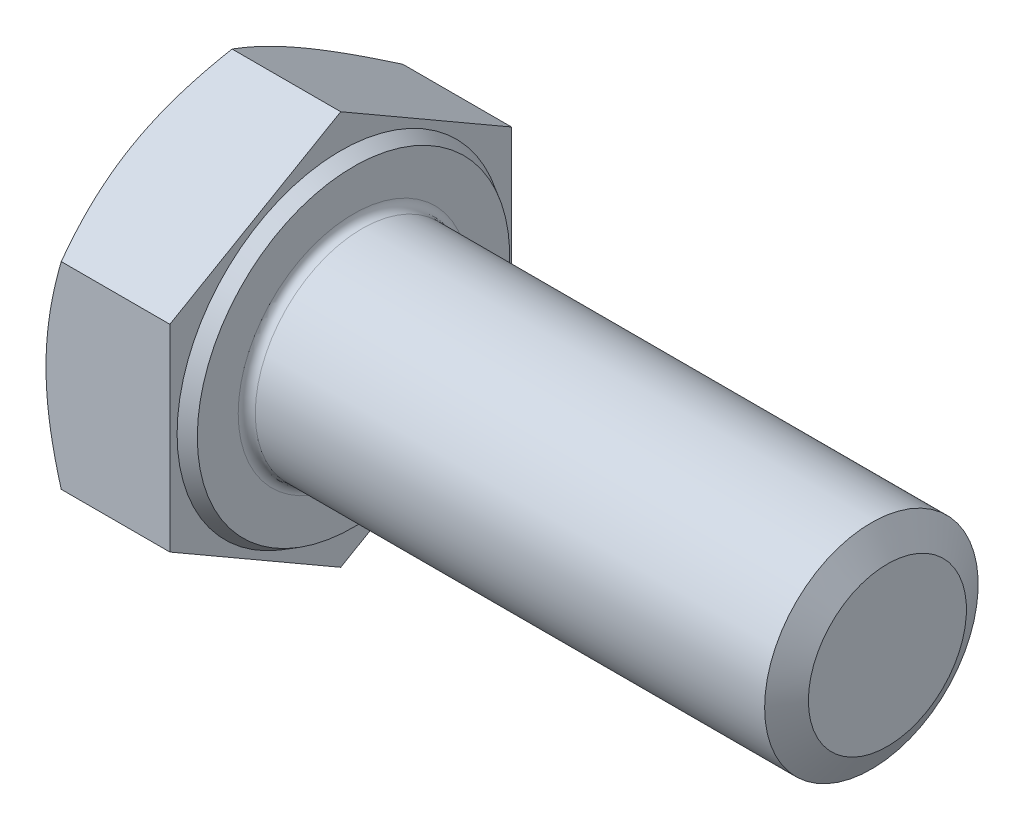
ISO-10303-21;
HEADER;
FILE_DESCRIPTION(('STEP AP214'),'2;1');
FILE_NAME('part.step','',(''),(''),'','','');
FILE_SCHEMA(('AUTOMOTIVE_DESIGN { 1 0 10303 214 1 1 1 1 }'));
ENDSEC;
DATA;
#1=APPLICATION_CONTEXT('core data for automotive mechanical design processes');
#2=APPLICATION_PROTOCOL_DEFINITION('international standard','automotive_design',2000,#1);
#3=PRODUCT_CONTEXT('',#1,'mechanical');
#4=PRODUCT('Part','Part','',(#3));
#5=PRODUCT_RELATED_PRODUCT_CATEGORY('part','',(#4));
#6=PRODUCT_DEFINITION_FORMATION('','',#4);
#7=PRODUCT_DEFINITION_CONTEXT('part definition',#1,'design');
#8=PRODUCT_DEFINITION('design','',#6,#7);
#9=PRODUCT_DEFINITION_SHAPE('','',#8);
#10=(LENGTH_UNIT() NAMED_UNIT(*) SI_UNIT(.MILLI.,.METRE.));
#11=(NAMED_UNIT(*) PLANE_ANGLE_UNIT() SI_UNIT($,.RADIAN.));
#12=(NAMED_UNIT(*) SI_UNIT($,.STERADIAN.) SOLID_ANGLE_UNIT());
#13=UNCERTAINTY_MEASURE_WITH_UNIT(LENGTH_MEASURE(1.E-05),#10,'distance_accuracy_value','');
#14=(GEOMETRIC_REPRESENTATION_CONTEXT(3) GLOBAL_UNCERTAINTY_ASSIGNED_CONTEXT((#13)) GLOBAL_UNIT_ASSIGNED_CONTEXT((#10,
#11,#12)) REPRESENTATION_CONTEXT('',''));
#15=CARTESIAN_POINT('',(0.,0.,0.));
#16=DIRECTION('',(0.,0.,1.));
#17=DIRECTION('',(1.,0.,0.));
#18=AXIS2_PLACEMENT_3D('',#15,#16,#17);
#19=CARTESIAN_POINT('',(0.,0.,0.));
#20=DIRECTION('',(-1.,0.,0.));
#21=DIRECTION('',(0.,0.,1.));
#22=AXIS2_PLACEMENT_3D('',#19,#20,#21);
#23=CYLINDRICAL_SURFACE('',#22,5.);
#24=CARTESIAN_POINT('',(6.8,0.,0.));
#25=DIRECTION('',(1.,0.,0.));
#26=DIRECTION('',(0.,0.,-1.));
#27=AXIS2_PLACEMENT_3D('',#24,#25,#26);
#28=CIRCLE('',#27,5.);
#29=CARTESIAN_POINT('',(6.8,0.,-5.));
#30=VERTEX_POINT('',#29);
#31=EDGE_CURVE('E11',#30,#30,#28,.T.);
#32=ORIENTED_EDGE('',*,*,#31,.T.);
#33=EDGE_LOOP('',(#32));
#34=FACE_BOUND('',#33,.T.);
#35=CARTESIAN_POINT('',(30.65,0.,0.));
#36=DIRECTION('',(-1.,0.,0.));
#37=DIRECTION('',(0.,0.,1.));
#38=AXIS2_PLACEMENT_3D('',#35,#36,#37);
#39=CIRCLE('',#38,5.);
#40=CARTESIAN_POINT('',(30.65,0.,5.));
#41=VERTEX_POINT('',#40);
#42=EDGE_CURVE('E435',#41,#41,#39,.T.);
#43=ORIENTED_EDGE('',*,*,#42,.T.);
#44=EDGE_LOOP('',(#43));
#45=FACE_BOUND('',#44,.T.);
#46=ADVANCED_FACE('F40',(#34,#45),#23,.T.);
#47=CARTESIAN_POINT('',(6.4,4.618802153517,-8.));
#48=DIRECTION('',(0.,-0.866025403784438,0.500000000000001));
#49=DIRECTION('',(0.,-0.500000000000001,-0.866025403784438));
#50=AXIS2_PLACEMENT_3D('',#47,#48,#49);
#51=PLANE('',#50);
#52=DIRECTION('',(0.,0.500000000000001,0.866025403784438));
#53=VECTOR('',#52,1.);
#54=CARTESIAN_POINT('',(5.80000000000001,4.618802153517,-8.));
#55=LINE('',#54,#53);
#56=CARTESIAN_POINT('',(5.80000000000001,4.61880215351702,-8.));
#57=VERTEX_POINT('',#56);
#58=CARTESIAN_POINT('',(5.80000000000001,9.23760430703402,0.));
#59=VERTEX_POINT('',#58);
#60=EDGE_CURVE('E117',#57,#59,#55,.T.);
#61=ORIENTED_EDGE('',*,*,#60,.F.);
#62=DIRECTION('',(-1.,0.,0.));
#63=VECTOR('',#62,1.);
#64=CARTESIAN_POINT('',(6.4,4.618802153517,-8.));
#65=LINE('',#64,#63);
#66=CARTESIAN_POINT('',(0.714531179816321,4.618802153517,-8.));
#67=VERTEX_POINT('',#66);
#68=EDGE_CURVE('E301',#57,#67,#65,.T.);
#69=ORIENTED_EDGE('',*,*,#68,.T.);
#70=CARTESIAN_POINT('',(0.714597847732979,9.23771977708786,0.0002));
#71=CARTESIAN_POINT('',(0.655990714047304,9.13619343437813,-0.175648783879896));
#72=CARTESIAN_POINT('',(0.600043401047296,9.03428856550538,-0.352153194306135));
#73=CARTESIAN_POINT('',(0.494201005024671,8.82965122633297,-0.70659546287846));
#74=CARTESIAN_POINT('',(0.444308534431071,8.72691841905233,-0.884533904692713));
#75=CARTESIAN_POINT('',(0.30469279720687,8.41707512197076,-1.42119823762264));
#76=CARTESIAN_POINT('',(0.225281170978371,8.20874154247285,-1.78204258223572));
#77=CARTESIAN_POINT('',(0.13216164629449,7.89697436704785,-2.32203917020405));
#78=CARTESIAN_POINT('',(0.105634581029126,7.79447216638295,-2.49957818964329));
#79=CARTESIAN_POINT('',(0.061153174858877,7.58900421950647,-2.8554591129602));
#80=CARTESIAN_POINT('',(0.0431980765145806,7.4860385150631,-3.03380094449324));
#81=CARTESIAN_POINT('',(0.0163156484918648,7.27992981503517,-3.3907916848236));
#82=CARTESIAN_POINT('',(0.00737807354623273,7.17678715432034,-3.5694400136095));
#83=CARTESIAN_POINT('',(-0.00127769603487048,6.97040655051484,-3.92690170509738));
#84=CARTESIAN_POINT('',(-0.000996175497150299,6.86716861046638,-4.10571506253007));
#85=CARTESIAN_POINT('',(0.00814502526877506,6.67416139438126,-4.44001336701691));
#86=CARTESIAN_POINT('',(0.0158896043673686,6.58437849849726,-4.59552190433867));
#87=CARTESIAN_POINT('',(0.0382011348534267,6.40502298765178,-4.90617476174051));
#88=CARTESIAN_POINT('',(0.0527685461381459,6.31545038727451,-5.06131905656));
#89=CARTESIAN_POINT('',(0.106360690527534,6.04707935721953,-5.52615131589482));
#90=CARTESIAN_POINT('',(0.155268641669141,5.86875596743374,-5.83501648718172));
#91=CARTESIAN_POINT('',(0.27753940323431,5.51021755801477,-6.4560232287603));
#92=CARTESIAN_POINT('',(0.351420520375996,5.3300482973958,-6.76808554211448));
#93=CARTESIAN_POINT('',(0.519100141254969,4.97239658367397,-7.38755648169476));
#94=CARTESIAN_POINT('',(0.612859260854453,4.79490955046824,-7.69497304089175));
#95=CARTESIAN_POINT('',(0.714597847732973,4.61868668346316,-8.0002));
#96=B_SPLINE_CURVE_WITH_KNOTS('',3,(#70,#71,#72,#73,#74,#75,#76,#77,#78,#79,#80,#81,#82,#83,#84,
#85,#86,#87,#88,#89,#90,#91,#92,#93,#94,#95),.UNSPECIFIED.,.F.,.F.,(4,2,2,2,2,2,2,2,2,2,2,2,4),
(0.,0.633973543721351,1.26821965714356,2.53934712434766,3.15934343977049,3.77928496069784,
4.39852133866766,5.01773858515596,5.55680239410249,6.09590254421148,7.17487077411836,
8.27776850154294,9.37850115249056),.UNSPECIFIED.);
#97=CARTESIAN_POINT('',(0.,6.9282032302755,-4.00000000000001));
#98=VERTEX_POINT('',#97);
#99=EDGE_CURVE('E226',#98,#67,#96,.T.);
#100=ORIENTED_EDGE('',*,*,#99,.F.);
#101=CARTESIAN_POINT('',(0.714531179816328,9.23760430703402,0.));
#102=VERTEX_POINT('',#101);
#103=EDGE_CURVE('E63',#102,#98,#96,.T.);
#104=ORIENTED_EDGE('',*,*,#103,.F.);
#105=DIRECTION('',(-1.,0.,0.));
#106=VECTOR('',#105,1.);
#107=CARTESIAN_POINT('',(6.4,9.23760430703402,0.));
#108=LINE('',#107,#106);
#109=EDGE_CURVE('E136',#59,#102,#108,.T.);
#110=ORIENTED_EDGE('',*,*,#109,.F.);
#111=EDGE_LOOP('',(#61,#69,#100,#104,#110));
#112=FACE_BOUND('',#111,.T.);
#113=ADVANCED_FACE('F169',(#112),#51,.F.);
#114=CARTESIAN_POINT('',(6.4,9.23760430703402,0.));
#115=DIRECTION('',(0.,-0.866025403784438,-0.5));
#116=DIRECTION('',(0.,0.5,-0.866025403784439));
#117=AXIS2_PLACEMENT_3D('',#114,#115,#116);
#118=PLANE('',#117);
#119=DIRECTION('',(0.,-0.5,0.866025403784439));
#120=VECTOR('',#119,1.);
#121=CARTESIAN_POINT('',(5.80000000000001,9.23760430703402,0.));
#122=LINE('',#121,#120);
#123=CARTESIAN_POINT('',(5.80000000000001,4.618802153517,8.00000000000001));
#124=VERTEX_POINT('',#123);
#125=EDGE_CURVE('E111',#59,#124,#122,.T.);
#126=ORIENTED_EDGE('',*,*,#125,.F.);
#127=ORIENTED_EDGE('',*,*,#109,.T.);
#128=CARTESIAN_POINT('',(0.714597847732981,4.61868668346316,8.00020000000001));
#129=CARTESIAN_POINT('',(0.655990714047305,4.72021302617289,7.82435121612012));
#130=CARTESIAN_POINT('',(0.600043401047298,4.82211789504564,7.64784680569388));
#131=CARTESIAN_POINT('',(0.494201005024673,5.02675523421805,7.29340453712155));
#132=CARTESIAN_POINT('',(0.444308534431073,5.12948804149869,7.1154660953073));
#133=CARTESIAN_POINT('',(0.304692797206871,5.43933133858026,6.57880176237737));
#134=CARTESIAN_POINT('',(0.225281170978373,5.64766491807818,6.21795741776429));
#135=CARTESIAN_POINT('',(0.132161646294493,5.95943209350317,5.67796082979596));
#136=CARTESIAN_POINT('',(0.105634581029128,6.06193429416807,5.50042181035673));
#137=CARTESIAN_POINT('',(0.0611531748588798,6.26740224104455,5.14454088703981));
#138=CARTESIAN_POINT('',(0.0431980765145837,6.37036794548792,4.96619905550677));
#139=CARTESIAN_POINT('',(0.0163156484918682,6.57647664551585,4.60920831517642));
#140=CARTESIAN_POINT('',(0.00737807354623602,6.67961930623067,4.43055998639051));
#141=CARTESIAN_POINT('',(-0.00127769603486777,6.88599991003618,4.07309829490263));
#142=CARTESIAN_POINT('',(-0.000996175497148074,6.98923785008464,3.89428493746994));
#143=CARTESIAN_POINT('',(0.00814502526877756,7.18224506616975,3.5599866329831));
#144=CARTESIAN_POINT('',(0.0158896043673717,7.27202796205376,3.40447809566134));
#145=CARTESIAN_POINT('',(0.0382011348534304,7.45138347289924,3.0938252382595));
#146=CARTESIAN_POINT('',(0.0527685461381495,7.54095607327651,2.93868094344001));
#147=CARTESIAN_POINT('',(0.106360690527538,7.80932710333149,2.47384868410519));
#148=CARTESIAN_POINT('',(0.155268641669145,7.98765049311728,2.16498351281829));
#149=CARTESIAN_POINT('',(0.277539403234315,8.34618890253625,1.54397677123971));
#150=CARTESIAN_POINT('',(0.351420520376001,8.52635816315522,1.23191445788553));
#151=CARTESIAN_POINT('',(0.519100141254974,8.88400987687705,0.612443518305243));
#152=CARTESIAN_POINT('',(0.612859260854458,9.06149691008278,0.30502695910825));
#153=CARTESIAN_POINT('',(0.714597847732978,9.23771977708786,-0.000199999999999863));
#154=B_SPLINE_CURVE_WITH_KNOTS('',3,(#128,#129,#130,#131,#132,#133,#134,#135,#136,#137,#138,
#139,#140,#141,#142,#143,#144,#145,#146,#147,#148,#149,#150,#151,#152,#153),.UNSPECIFIED.,.F.,
.F.,(4,2,2,2,2,2,2,2,2,2,2,2,4),(0.,0.633973543721351,1.26821965714356,2.53934712434766,
3.15934343977049,3.77928496069784,4.39852133866766,5.01773858515596,5.5568023941025,
6.09590254421149,7.17487077411836,8.27776850154294,9.37850115249056),.UNSPECIFIED.);
#155=CARTESIAN_POINT('',(0.,6.92820323027551,4.));
#156=VERTEX_POINT('',#155);
#157=EDGE_CURVE('E238',#156,#102,#154,.T.);
#158=ORIENTED_EDGE('',*,*,#157,.F.);
#159=CARTESIAN_POINT('',(0.71453117981633,4.618802153517,8.00000000000001));
#160=VERTEX_POINT('',#159);
#161=EDGE_CURVE('E135',#160,#156,#154,.T.);
#162=ORIENTED_EDGE('',*,*,#161,.F.);
#163=DIRECTION('',(-1.,0.,0.));
#164=VECTOR('',#163,1.);
#165=CARTESIAN_POINT('',(6.4,4.618802153517,8.00000000000001));
#166=LINE('',#165,#164);
#167=EDGE_CURVE('E126',#124,#160,#166,.T.);
#168=ORIENTED_EDGE('',*,*,#167,.F.);
#169=EDGE_LOOP('',(#126,#127,#158,#162,#168));
#170=FACE_BOUND('',#169,.T.);
#171=ADVANCED_FACE('F133',(#170),#118,.F.);
#172=CARTESIAN_POINT('',(6.4,4.618802153517,8.00000000000001));
#173=DIRECTION('',(0.,0.,-1.));
#174=DIRECTION('',(-1.,0.,0.));
#175=AXIS2_PLACEMENT_3D('',#172,#173,#174);
#176=PLANE('',#175);
#177=DIRECTION('',(0.,-1.,0.));
#178=VECTOR('',#177,1.);
#179=CARTESIAN_POINT('',(5.80000000000001,4.618802153517,8.00000000000001));
#180=LINE('',#179,#178);
#181=CARTESIAN_POINT('',(5.80000000000001,-4.61880215351705,7.99999999999998));
#182=VERTEX_POINT('',#181);
#183=EDGE_CURVE('E114',#124,#182,#180,.T.);
#184=ORIENTED_EDGE('',*,*,#183,.F.);
#185=ORIENTED_EDGE('',*,*,#167,.T.);
#186=CARTESIAN_POINT('',(4.02490590955894,-12.6546855843618,8.00000000000001));
#187=CARTESIAN_POINT('',(3.85338487375996,-12.3031246800229,8.00000000000001));
#188=CARTESIAN_POINT('',(3.68343819387205,-11.9507829192251,8.00000000000001));
#189=CARTESIAN_POINT('',(3.3475742777212,-11.2441233293434,8.00000000000001));
#190=CARTESIAN_POINT('',(3.18165763115454,-10.889805220286,8.00000000000001));
#191=CARTESIAN_POINT('',(2.85395194343771,-10.1770689379399,8.00000000000001));
#192=CARTESIAN_POINT('',(2.69218824963995,-9.81863907172215,8.00000000000001));
#193=CARTESIAN_POINT('',(2.37495726740343,-9.09901412811104,8.00000000000001));
#194=CARTESIAN_POINT('',(2.21948969724238,-8.73781917530426,8.00000000000001));
#195=CARTESIAN_POINT('',(1.9112490961131,-7.99950051377999,8.00000000000001));
#196=CARTESIAN_POINT('',(1.7587567657267,-7.62225899058115,8.00000000000001));
#197=CARTESIAN_POINT('',(1.46472411298912,-6.86345576673946,8.00000000000001));
#198=CARTESIAN_POINT('',(1.32318498461759,-6.48189360029692,8.00000000000001));
#199=CARTESIAN_POINT('',(1.0545943250141,-5.71447512364448,8.00000000000001));
#200=CARTESIAN_POINT('',(0.927515476081584,-5.32862847439958,8.00000000000001));
#201=CARTESIAN_POINT('',(0.691757211097764,-4.5514188037396,8.00000000000001));
#202=CARTESIAN_POINT('',(0.583072254842136,-4.16005748194276,8.00000000000001));
#203=CARTESIAN_POINT('',(0.389750376844237,-3.37376378274522,8.00000000000001));
#204=CARTESIAN_POINT('',(0.304973724086291,-2.97886668674351,8.00000000000001));
#205=CARTESIAN_POINT('',(0.199275200237243,-2.38273452840884,8.00000000000001));
#206=CARTESIAN_POINT('',(0.167618755709474,-2.18337977711941,8.00000000000001));
#207=CARTESIAN_POINT('',(0.112075358694787,-1.78359737601687,8.00000000000001));
#208=CARTESIAN_POINT('',(0.0881876500546299,-1.58316983255306,8.00000000000001));
#209=CARTESIAN_POINT('',(0.0489706977401283,-1.18423542027827,8.00000000000001));
#210=CARTESIAN_POINT('',(0.0335291730980954,-0.985739637458783,8.00000000000001));
#211=CARTESIAN_POINT('',(0.0110629716488732,-0.588272086946696,8.00000000000001));
#212=CARTESIAN_POINT('',(0.00403814825768024,-0.389300327604107,8.00000000000001));
#213=CARTESIAN_POINT('',(-0.00142584062081182,0.0087622108148233,8.00000000000001));
#214=CARTESIAN_POINT('',(0.000134957676483573,0.207852989385582,8.00000000000001));
#215=CARTESIAN_POINT('',(0.0118014217876269,0.605786203078666,8.00000000000001));
#216=CARTESIAN_POINT('',(0.0219074673810787,0.804628626769902,8.00000000000001));
#217=CARTESIAN_POINT('',(0.0557165373437227,1.27520491378392,8.00000000000001));
#218=CARTESIAN_POINT('',(0.0830672695242142,1.54668291471762,8.00000000000001));
#219=CARTESIAN_POINT('',(0.152259238389076,2.08777092307491,8.00000000000001));
#220=CARTESIAN_POINT('',(0.19410224386366,2.35738069838154,8.00000000000001));
#221=CARTESIAN_POINT('',(0.339163188799744,3.16301774665637,8.00000000000001));
#222=CARTESIAN_POINT('',(0.461891294668976,3.69558688173415,8.00000000000001));
#223=CARTESIAN_POINT('',(0.676586595213058,4.49226053267628,8.00000000000001));
#224=CARTESIAN_POINT('',(0.754301850106127,4.76044512009591,8.00000000000001));
#225=CARTESIAN_POINT('',(0.918275616254532,5.29421544036083,8.00000000000001));
#226=CARTESIAN_POINT('',(1.00453419017724,5.55980115412704,8.00000000000001));
#227=CARTESIAN_POINT('',(1.18417203245489,6.08844836893927,8.00000000000001));
#228=CARTESIAN_POINT('',(1.27754931556251,6.35151055086862,8.00000000000001));
#229=CARTESIAN_POINT('',(1.47027924561322,6.87542420819578,8.00000000000001));
#230=CARTESIAN_POINT('',(1.56963178297476,7.13627572403546,8.00000000000001));
#231=CARTESIAN_POINT('',(1.83061788216801,7.80218874880571,8.00000000000001));
#232=CARTESIAN_POINT('',(1.99585030591403,8.20583800152899,8.00000000000001));
#233=CARTESIAN_POINT('',(2.33560643435574,9.00922090340243,8.00000000000001));
#234=CARTESIAN_POINT('',(2.5101309931742,9.4089541885889,8.00000000000001));
#235=CARTESIAN_POINT('',(2.86641484762338,10.2053302393418,8.00000000000001));
#236=CARTESIAN_POINT('',(3.04817649203489,10.6019719507727,8.00000000000001));
#237=CARTESIAN_POINT('',(3.41731474780413,11.3926098653434,8.00000000000001));
#238=CARTESIAN_POINT('',(3.60469117417197,11.7866061551194,8.00000000000001));
#239=CARTESIAN_POINT('',(3.98417976786822,12.5730081264133,8.00000000000001));
#240=CARTESIAN_POINT('',(4.17629837893026,12.9654106921397,8.00000000000001));
#241=CARTESIAN_POINT('',(4.56413460673708,13.7484335593548,8.00000000000001));
#242=CARTESIAN_POINT('',(4.7598522474602,14.1390538489476,8.00000000000001));
#243=CARTESIAN_POINT('',(5.15417790496088,14.9187386930099,8.00000000000001));
#244=CARTESIAN_POINT('',(5.35278537052951,15.3078035265797,8.00000000000001));
#245=CARTESIAN_POINT('',(5.75241277357117,16.0846929446673,8.00000000000001));
#246=CARTESIAN_POINT('',(5.95343272118933,16.4725175239607,8.00000000000001));
#247=CARTESIAN_POINT('',(6.52023157707934,17.5591699504467,8.00000000000001));
#248=CARTESIAN_POINT('',(6.88826669162662,18.2568207923885,8.00000000000001));
#249=CARTESIAN_POINT('',(7.6291164571679,19.6496204420456,8.00000000000001));
#250=CARTESIAN_POINT('',(8.00193135552979,20.3447691178627,8.00000000000001));
#251=CARTESIAN_POINT('',(8.74998840178784,21.730949342628,8.00000000000001));
#252=CARTESIAN_POINT('',(9.12521929790293,22.4219869677796,8.00000000000001));
#253=CARTESIAN_POINT('',(9.69012625678308,23.4573861735835,8.00000000000001));
#254=CARTESIAN_POINT('',(9.8787653727905,23.8023143161837,8.00000000000001));
#255=CARTESIAN_POINT('',(10.2566598278908,24.4918321964472,8.00000000000001));
#256=CARTESIAN_POINT('',(10.4459151660088,24.8364219346447,8.00000000000001));
#257=CARTESIAN_POINT('',(10.6354414407821,25.1808626322183,8.00000000000001));
#258=B_SPLINE_CURVE_WITH_KNOTS('',3,(#186,#187,#188,#189,#190,#191,#192,#193,#194,#195,#196,
#197,#198,#199,#200,#201,#202,#203,#204,#205,#206,#207,#208,#209,#210,#211,#212,#213,#214,#215,
#216,#217,#218,#219,#220,#221,#222,#223,#224,#225,#226,#227,#228,#229,#230,#231,#232,#233,#234,
#235,#236,#237,#238,#239,#240,#241,#242,#243,#244,#245,#246,#247,#248,#249,#250,#251,#252,#253,
#254,#255,#256,#257),.UNSPECIFIED.,.F.,.F.,(4,2,2,2,2,2,2,2,2,2,2,2,2,2,2,2,2,2,2,2,2,2,2,2,2,2,
2,2,2,2,2,2,2,2,2,4),(0.,1.1735253428552,2.34722138025918,3.52689945010168,4.70652467637678,
5.92708317141317,7.14777452944082,8.36612012171136,9.58409809506412,10.7948027119676,
11.4002329189197,12.0056041799731,12.6027191107726,13.1998236421571,13.7969256548694,
14.3940542062034,15.2121538291978,16.0303533369241,17.6675489652002,18.5051258655031,
19.3427089100959,20.1800592201862,21.0173941785985,22.3257038346386,23.6341339573729,
24.9429922461244,26.2518074593073,27.5625113626672,28.8732240016859,30.1836898283922,
31.4941611678942,33.8604585893125,36.2268789719358,38.5858914350283,39.7653150976313,
40.9447368953006),.UNSPECIFIED.);
#259=CARTESIAN_POINT('',(0.,0.,8.));
#260=VERTEX_POINT('',#259);
#261=EDGE_CURVE('E244',#260,#160,#258,.T.);
#262=ORIENTED_EDGE('',*,*,#261,.F.);
#263=CARTESIAN_POINT('',(0.714531179816339,-4.61880215351704,8.00000000000001));
#264=VERTEX_POINT('',#263);
#265=EDGE_CURVE('E300',#264,#260,#258,.T.);
#266=ORIENTED_EDGE('',*,*,#265,.F.);
#267=DIRECTION('',(-1.,0.,0.));
#268=VECTOR('',#267,1.);
#269=CARTESIAN_POINT('',(6.4,-4.61880215351703,8.00000000000001));
#270=LINE('',#269,#268);
#271=EDGE_CURVE('E129',#182,#264,#270,.T.);
#272=ORIENTED_EDGE('',*,*,#271,.F.);
#273=EDGE_LOOP('',(#184,#185,#262,#266,#272));
#274=FACE_BOUND('',#273,.T.);
#275=ADVANCED_FACE('F124',(#274),#176,.F.);
#276=CARTESIAN_POINT('',(6.4,-9.23760430703406,0.));
#277=DIRECTION('',(0.,0.866025403784438,-0.500000000000001));
#278=DIRECTION('',(0.,0.500000000000001,0.866025403784438));
#279=AXIS2_PLACEMENT_3D('',#276,#277,#278);
#280=PLANE('',#279);
#281=DIRECTION('',(0.,-0.500000000000001,-0.866025403784438));
#282=VECTOR('',#281,1.);
#283=CARTESIAN_POINT('',(5.80000000000001,-9.23760430703406,0.));
#284=LINE('',#283,#282);
#285=CARTESIAN_POINT('',(5.80000000000001,-9.23760430703402,0.));
#286=VERTEX_POINT('',#285);
#287=EDGE_CURVE('E130',#182,#286,#284,.T.);
#288=ORIENTED_EDGE('',*,*,#287,.F.);
#289=ORIENTED_EDGE('',*,*,#271,.T.);
#290=CARTESIAN_POINT('',(0.714597847733003,-9.2377197770879,-0.000199999999998807));
#291=CARTESIAN_POINT('',(0.655990714047327,-9.13619343437817,0.175648783879898));
#292=CARTESIAN_POINT('',(0.600043401047319,-9.03428856550543,0.352153194306137));
#293=CARTESIAN_POINT('',(0.494201005024694,-8.82965122633301,0.706595462878463));
#294=CARTESIAN_POINT('',(0.444308534431094,-8.72691841905237,0.884533904692717));
#295=CARTESIAN_POINT('',(0.304692797206892,-8.4170751219708,1.42119823762265));
#296=CARTESIAN_POINT('',(0.225281170978394,-8.20874154247288,1.78204258223573));
#297=CARTESIAN_POINT('',(0.132161646294512,-7.89697436704789,2.32203917020406));
#298=CARTESIAN_POINT('',(0.105634581029147,-7.79447216638298,2.4995781896433));
#299=CARTESIAN_POINT('',(0.0611531748588983,-7.58900421950651,2.85545911296021));
#300=CARTESIAN_POINT('',(0.0431980765146029,-7.48603851506314,3.03380094449325));
#301=CARTESIAN_POINT('',(0.0163156484918872,-7.2799298150352,3.39079168482361));
#302=CARTESIAN_POINT('',(0.0073780735462544,-7.17678715432038,3.56944001360952));
#303=CARTESIAN_POINT('',(-0.00127769603484956,-6.97040655051487,3.9269017050974));
#304=CARTESIAN_POINT('',(-0.000996175497129402,-6.86716861046641,4.10571506253009));
#305=CARTESIAN_POINT('',(0.00814502526879641,-6.6741613943813,4.44001336701693));
#306=CARTESIAN_POINT('',(0.0158896043673903,-6.58437849849729,4.59552190433869));
#307=CARTESIAN_POINT('',(0.0382011348534486,-6.40502298765181,4.90617476174053));
#308=CARTESIAN_POINT('',(0.0527685461381676,-6.31545038727454,5.06131905656002));
#309=CARTESIAN_POINT('',(0.106360690527555,-6.04707935721957,5.52615131589484));
#310=CARTESIAN_POINT('',(0.155268641669162,-5.86875596743377,5.83501648718174));
#311=CARTESIAN_POINT('',(0.27753940323433,-5.51021755801481,6.45602322876032));
#312=CARTESIAN_POINT('',(0.351420520376015,-5.33004829739583,6.76808554211449));
#313=CARTESIAN_POINT('',(0.519100141254986,-4.97239658367401,7.38755648169477));
#314=CARTESIAN_POINT('',(0.612859260854469,-4.79490955046828,7.69497304089177));
#315=CARTESIAN_POINT('',(0.714597847732989,-4.6186866834632,8.00020000000001));
#316=B_SPLINE_CURVE_WITH_KNOTS('',3,(#290,#291,#292,#293,#294,#295,#296,#297,#298,#299,#300,
#301,#302,#303,#304,#305,#306,#307,#308,#309,#310,#311,#312,#313,#314,#315),.UNSPECIFIED.,.F.,
.F.,(4,2,2,2,2,2,2,2,2,2,2,2,4),(0.,0.633973543721354,1.26821965714357,2.53934712434767,
3.15934343977051,3.77928496069786,4.39852133866768,5.01773858515598,5.55680239410251,
6.0959025442115,7.17487077411837,8.27776850154295,9.37850115249057),.UNSPECIFIED.);
#317=CARTESIAN_POINT('',(0.,-6.92820323027551,4.00000000000001));
#318=VERTEX_POINT('',#317);
#319=EDGE_CURVE('E299',#318,#264,#316,.T.);
#320=ORIENTED_EDGE('',*,*,#319,.F.);
#321=CARTESIAN_POINT('',(0.714531179816351,-9.23760430703406,0.));
#322=VERTEX_POINT('',#321);
#323=EDGE_CURVE('E232',#322,#318,#316,.T.);
#324=ORIENTED_EDGE('',*,*,#323,.F.);
#325=DIRECTION('',(-1.,0.,0.));
#326=VECTOR('',#325,1.);
#327=CARTESIAN_POINT('',(6.4,-9.23760430703406,0.));
#328=LINE('',#327,#326);
#329=EDGE_CURVE('E140',#286,#322,#328,.T.);
#330=ORIENTED_EDGE('',*,*,#329,.F.);
#331=EDGE_LOOP('',(#288,#289,#320,#324,#330));
#332=FACE_BOUND('',#331,.T.);
#333=ADVANCED_FACE('F256',(#332),#280,.F.);
#334=CARTESIAN_POINT('',(6.4,-4.61880215351703,-8.00000000000001));
#335=DIRECTION('',(0.,0.866025403784438,0.500000000000002));
#336=DIRECTION('',(0.,-0.500000000000002,0.866025403784438));
#337=AXIS2_PLACEMENT_3D('',#334,#335,#336);
#338=PLANE('',#337);
#339=DIRECTION('',(0.,0.500000000000002,-0.866025403784438));
#340=VECTOR('',#339,1.);
#341=CARTESIAN_POINT('',(5.80000000000001,-4.61880215351703,-8.00000000000001));
#342=LINE('',#341,#340);
#343=CARTESIAN_POINT('',(5.80000000000001,-4.61880215351703,-8.00000000000001));
#344=VERTEX_POINT('',#343);
#345=EDGE_CURVE('E55',#286,#344,#342,.T.);
#346=ORIENTED_EDGE('',*,*,#345,.F.);
#347=ORIENTED_EDGE('',*,*,#329,.T.);
#348=CARTESIAN_POINT('',(0.714597847732985,-4.61868668346319,-8.00020000000001));
#349=CARTESIAN_POINT('',(0.65599071404731,-4.72021302617292,-7.82435121612011));
#350=CARTESIAN_POINT('',(0.600043401047302,-4.82211789504566,-7.64784680569387));
#351=CARTESIAN_POINT('',(0.494201005024679,-5.02675523421808,-7.29340453712155));
#352=CARTESIAN_POINT('',(0.44430853443108,-5.12948804149872,-7.11546609530729));
#353=CARTESIAN_POINT('',(0.30469279720688,-5.43933133858029,-6.57880176237736));
#354=CARTESIAN_POINT('',(0.225281170978382,-5.64766491807821,-6.21795741776428));
#355=CARTESIAN_POINT('',(0.132161646294503,-5.9594320935032,-5.67796082979595));
#356=CARTESIAN_POINT('',(0.105634581029139,-6.06193429416811,-5.50042181035672));
#357=CARTESIAN_POINT('',(0.0611531748588919,-6.26740224104458,-5.1445408870398));
#358=CARTESIAN_POINT('',(0.0431980765145967,-6.37036794548795,-4.96619905550676));
#359=CARTESIAN_POINT('',(0.0163156484918822,-6.57647664551589,-4.60920831517641));
#360=CARTESIAN_POINT('',(0.00737807354625032,-6.67961930623071,-4.4305599863905));
#361=CARTESIAN_POINT('',(-0.00127769603485202,-6.88599991003622,-4.07309829490262));
#362=CARTESIAN_POINT('',(-0.000996175497131119,-6.98923785008468,-3.89428493746993));
#363=CARTESIAN_POINT('',(0.00814502526879558,-7.18224506616979,-3.55998663298309));
#364=CARTESIAN_POINT('',(0.0158896043673897,-7.2720279620538,-3.40447809566133));
#365=CARTESIAN_POINT('',(0.0382011348534487,-7.45138347289928,-3.09382523825949));
#366=CARTESIAN_POINT('',(0.0527685461381682,-7.54095607327655,-2.93868094344));
#367=CARTESIAN_POINT('',(0.106360690527558,-7.80932710333153,-2.47384868410518));
#368=CARTESIAN_POINT('',(0.155268641669167,-7.98765049311732,-2.16498351281828));
#369=CARTESIAN_POINT('',(0.277539403234337,-8.34618890253629,-1.5439767712397));
#370=CARTESIAN_POINT('',(0.351420520376023,-8.52635816315526,-1.23191445788552));
#371=CARTESIAN_POINT('',(0.519100141254995,-8.88400987687709,-0.612443518305241));
#372=CARTESIAN_POINT('',(0.612859260854479,-9.06149691008282,-0.305026959108249));
#373=CARTESIAN_POINT('',(0.714597847733001,-9.2377197770879,0.00020000000000055));
#374=B_SPLINE_CURVE_WITH_KNOTS('',3,(#348,#349,#350,#351,#352,#353,#354,#355,#356,#357,#358,
#359,#360,#361,#362,#363,#364,#365,#366,#367,#368,#369,#370,#371,#372,#373),.UNSPECIFIED.,.F.,
.F.,(4,2,2,2,2,2,2,2,2,2,2,2,4),(0.,0.633973543721353,1.26821965714357,2.53934712434766,
3.1593434397705,3.77928496069785,4.39852133866767,5.01773858515596,5.5568023941025,
6.09590254421149,7.17487077411836,8.27776850154294,9.37850115249056),.UNSPECIFIED.);
#375=CARTESIAN_POINT('',(0.,-6.9282032302755,-4.00000000000001));
#376=VERTEX_POINT('',#375);
#377=EDGE_CURVE('E284',#376,#322,#374,.T.);
#378=ORIENTED_EDGE('',*,*,#377,.F.);
#379=CARTESIAN_POINT('',(0.71453117981617,-4.61880215351728,-8.00000000000001));
#380=VERTEX_POINT('',#379);
#381=EDGE_CURVE('E206',#380,#376,#374,.T.);
#382=ORIENTED_EDGE('',*,*,#381,.F.);
#383=DIRECTION('',(-1.,0.,0.));
#384=VECTOR('',#383,1.);
#385=CARTESIAN_POINT('',(6.4,-4.61880215351703,-8.00000000000001));
#386=LINE('',#385,#384);
#387=EDGE_CURVE('E296',#344,#380,#386,.T.);
#388=ORIENTED_EDGE('',*,*,#387,.F.);
#389=EDGE_LOOP('',(#346,#347,#378,#382,#388));
#390=FACE_BOUND('',#389,.T.);
#391=ADVANCED_FACE('F190',(#390),#338,.F.);
#392=CARTESIAN_POINT('',(6.4,4.618802153517,-8.));
#393=DIRECTION('',(0.,0.,1.));
#394=DIRECTION('',(0.,-1.,0.));
#395=AXIS2_PLACEMENT_3D('',#392,#393,#394);
#396=PLANE('',#395);
#397=DIRECTION('',(0.,1.,0.));
#398=VECTOR('',#397,1.);
#399=CARTESIAN_POINT('',(5.80000000000001,4.618802153517,-8.));
#400=LINE('',#399,#398);
#401=EDGE_CURVE('E148',#344,#57,#400,.T.);
#402=ORIENTED_EDGE('',*,*,#401,.F.);
#403=ORIENTED_EDGE('',*,*,#387,.T.);
#404=CARTESIAN_POINT('',(4.02490591677332,-12.654685599145,-8.00000000000001));
#405=CARTESIAN_POINT('',(3.85338488067435,-12.3031246943085,-8.00000000000001));
#406=CARTESIAN_POINT('',(3.68343820048662,-11.9507829330127,-8.00000000000001));
#407=CARTESIAN_POINT('',(3.34757428373756,-11.2441233421334,-8.00000000000001));
#408=CARTESIAN_POINT('',(3.18165763687252,-10.8898052325765,-8.00000000000001));
#409=CARTESIAN_POINT('',(2.85395194855882,-10.177068949224,-8.00000000000001));
#410=CARTESIAN_POINT('',(2.69218825446261,-9.81863908249934,-8.00000000000001));
#411=CARTESIAN_POINT('',(2.37495727163406,-9.09901413787104,-8.00000000000001));
#412=CARTESIAN_POINT('',(2.21948970117943,-8.73781918455399,-8.00000000000001));
#413=CARTESIAN_POINT('',(1.91124909945302,-7.99950052196694,-8.00000000000001));
#414=CARTESIAN_POINT('',(1.7587567687638,-7.62225899821525,-8.00000000000001));
#415=CARTESIAN_POINT('',(1.46472411543648,-6.8634557732591,-8.00000000000001));
#416=CARTESIAN_POINT('',(1.32318498677803,-6.48189360625496,-8.00000000000001));
#417=CARTESIAN_POINT('',(1.05459432662762,-5.71447512846897,-8.00000000000001));
#418=CARTESIAN_POINT('',(0.927515477435026,-5.32862847865215,-8.00000000000001));
#419=CARTESIAN_POINT('',(0.69175721197266,-4.551418806833,-8.00000000000001));
#420=CARTESIAN_POINT('',(0.583072255498534,-4.16005748444891,-8.00000000000001));
#421=CARTESIAN_POINT('',(0.389750377059017,-3.37376378378107,-8.00000000000001));
#422=CARTESIAN_POINT('',(0.304973724094157,-2.97886668689224,-8.00000000000001));
#423=CARTESIAN_POINT('',(0.199275200034076,-2.38273452721079,-8.00000000000001));
#424=CARTESIAN_POINT('',(0.167618755452539,-2.18337977546991,-8.00000000000001));
#425=CARTESIAN_POINT('',(0.112075358367344,-1.78359737346044,-8.00000000000001));
#426=CARTESIAN_POINT('',(0.0881876497104404,-1.58316982954117,-8.00000000000001));
#427=CARTESIAN_POINT('',(0.0489706974028785,-1.18423541636503,-8.00000000000001));
#428=CARTESIAN_POINT('',(0.0335291727837735,-0.985739633099715,-8.));
#429=CARTESIAN_POINT('',(0.0110629714200315,-0.588272081696598,-8.));
#430=CARTESIAN_POINT('',(0.00403814809139016,-0.389300321908807,-8.));
#431=CARTESIAN_POINT('',(-0.00142584062307963,0.00876221739736904,-8.));
#432=CARTESIAN_POINT('',(0.000134957775691983,0.207852996410172,-8.));
#433=CARTESIAN_POINT('',(0.0118014221261105,0.605786210981711,-8.));
#434=CARTESIAN_POINT('',(0.0219074678573647,0.804628635109357,-8.));
#435=CARTESIAN_POINT('',(0.0557165381587503,1.27520492278815,-8.));
#436=CARTESIAN_POINT('',(0.0830672705335634,1.54668292394837,-8.));
#437=CARTESIAN_POINT('',(0.15225923979733,2.08777093274816,-8.));
#438=CARTESIAN_POINT('',(0.194102245476499,2.35738070827077,-8.));
#439=CARTESIAN_POINT('',(0.339163191030425,3.16301775718135,-8.));
#440=CARTESIAN_POINT('',(0.46189129731674,3.69558689266568,-8.));
#441=CARTESIAN_POINT('',(0.676586598475542,4.49226054421556,-8.));
#442=CARTESIAN_POINT('',(0.754301853574803,4.76044513184215,-8.));
#443=CARTESIAN_POINT('',(0.918275620129017,5.29421545251855,-8.));
#444=CARTESIAN_POINT('',(1.00453419425134,5.55980116648927,-8.));
#445=CARTESIAN_POINT('',(1.18417203692079,6.08844838170893,-8.));
#446=CARTESIAN_POINT('',(1.27754932022057,6.3515105638412,-8.));
#447=CARTESIAN_POINT('',(1.47027925064865,6.8754242215742,-8.));
#448=CARTESIAN_POINT('',(1.5696317881954,7.1362757376168,-8.));
#449=CARTESIAN_POINT('',(1.83061788769922,7.80218876251023,-8.));
#450=CARTESIAN_POINT('',(1.99585031155406,8.20583801515883,-8.));
#451=CARTESIAN_POINT('',(2.33560644018456,9.00922091689217,-8.));
#452=CARTESIAN_POINT('',(2.510130999083,9.4089542020132,-8.));
#453=CARTESIAN_POINT('',(2.86641485367068,10.2053302526422,-8.));
#454=CARTESIAN_POINT('',(3.0481764981407,10.6019719640145,-7.99999999999999));
#455=CARTESIAN_POINT('',(3.41731475401142,11.3926098784745,-7.99999999999999));
#456=CARTESIAN_POINT('',(3.60469118042222,11.7866061681983,-7.99999999999999));
#457=CARTESIAN_POINT('',(3.98417977419136,12.5730081393898,-7.99999999999999));
#458=CARTESIAN_POINT('',(4.17629838528328,12.9654107050658,-7.99999999999999));
#459=CARTESIAN_POINT('',(4.56413461314097,13.7484335721844,-7.99999999999999));
#460=CARTESIAN_POINT('',(4.75985225388508,14.1390538617308,-7.99999999999999));
#461=CARTESIAN_POINT('',(5.15417791142116,14.9187387057041,-7.99999999999999));
#462=CARTESIAN_POINT('',(5.35278537700421,15.3078035392312,-7.99999999999999));
#463=CARTESIAN_POINT('',(5.75241278006941,16.0846929572358,-7.99999999999999));
#464=CARTESIAN_POINT('',(5.9534327276967,16.4725175364891,-7.99999999999999));
#465=CARTESIAN_POINT('',(6.52023158363779,17.559169962925,-7.99999999999999));
#466=CARTESIAN_POINT('',(6.88826669822291,18.2568208048589,-7.99999999999999));
#467=CARTESIAN_POINT('',(7.62911646383156,19.6496204545043,-7.99999999999999));
#468=CARTESIAN_POINT('',(8.00193136222297,20.3447691303174,-7.99999999999999));
#469=CARTESIAN_POINT('',(8.74998840854046,21.7309493550891,-7.99999999999999));
#470=CARTESIAN_POINT('',(9.12521930468554,22.4219869802512,-7.99999999999999));
#471=CARTESIAN_POINT('',(9.69012626360779,23.4573861860725,-7.99999999999999));
#472=CARTESIAN_POINT('',(9.8787653796288,23.8023143286787,-7.99999999999999));
#473=CARTESIAN_POINT('',(10.2566598347554,24.4918322089549,-7.99999999999999));
#474=CARTESIAN_POINT('',(10.4459151728861,24.836421947159,-7.99999999999999));
#475=CARTESIAN_POINT('',(10.6354414476718,25.1808626447394,-7.99999999999998));
#476=B_SPLINE_CURVE_WITH_KNOTS('',3,(#404,#405,#406,#407,#408,#409,#410,#411,#412,#413,#414,
#415,#416,#417,#418,#419,#420,#421,#422,#423,#424,#425,#426,#427,#428,#429,#430,#431,#432,#433,
#434,#435,#436,#437,#438,#439,#440,#441,#442,#443,#444,#445,#446,#447,#448,#449,#450,#451,#452,
#453,#454,#455,#456,#457,#458,#459,#460,#461,#462,#463,#464,#465,#466,#467,#468,#469,#470,#471,
#472,#473,#474,#475),.UNSPECIFIED.,.F.,.F.,(4,2,2,2,2,2,2,2,2,2,2,2,2,2,2,2,2,2,2,2,2,2,2,2,2,2,
2,2,2,2,2,2,2,2,2,4),(0.,1.17352534459167,2.34722138373236,3.52689945532928,4.70652468335869,
5.92708318027307,7.14777454017933,8.36612013432259,9.58409810954662,10.794802729176,
11.40023293749,12.005604199905,12.6027191320313,13.1998236647426,13.7969256787822,
14.3940542314437,15.2121538551722,16.0303533636327,17.6675489933806,18.5051258944523,
19.3427089398139,20.180059250671,21.0173942098501,22.3257038658076,23.6341339884584,
24.9429922771239,26.2518074902209,27.5625113934848,28.8732240324076,30.1836898590194,
31.4941611984269,33.8604586198774,36.2268790025322,38.5858914656952,39.7653151283338,
40.9447369260388),.UNSPECIFIED.);
#477=CARTESIAN_POINT('',(0.,0.,-8.));
#478=VERTEX_POINT('',#477);
#479=EDGE_CURVE('E195',#478,#380,#476,.F.);
#480=ORIENTED_EDGE('',*,*,#479,.F.);
#481=EDGE_CURVE('E203',#67,#478,#476,.F.);
#482=ORIENTED_EDGE('',*,*,#481,.F.);
#483=ORIENTED_EDGE('',*,*,#68,.F.);
#484=EDGE_LOOP('',(#402,#403,#480,#482,#483));
#485=FACE_BOUND('',#484,.T.);
#486=ADVANCED_FACE('F185',(#485),#396,.F.);
#487=CARTESIAN_POINT('',(0.,0.,0.));
#488=DIRECTION('',(1.,0.,0.));
#489=DIRECTION('',(0.,0.,-1.));
#490=AXIS2_PLACEMENT_3D('',#487,#488,#489);
#491=CONICAL_SURFACE('',#490,8.,1.0471975511966);
#492=ORIENTED_EDGE('',*,*,#381,.T.);
#493=CARTESIAN_POINT('',(0.,0.,0.));
#494=DIRECTION('',(1.,0.,0.));
#495=DIRECTION('',(0.,0.,-1.));
#496=AXIS2_PLACEMENT_3D('',#493,#494,#495);
#497=CIRCLE('',#496,8.);
#498=EDGE_CURVE('E138',#376,#478,#497,.T.);
#499=ORIENTED_EDGE('',*,*,#498,.T.);
#500=ORIENTED_EDGE('',*,*,#479,.T.);
#501=EDGE_LOOP('',(#492,#499,#500));
#502=FACE_BOUND('',#501,.T.);
#503=ADVANCED_FACE('F189',(#502),#491,.T.);
#504=ORIENTED_EDGE('',*,*,#323,.T.);
#505=EDGE_CURVE('E146',#318,#376,#497,.T.);
#506=ORIENTED_EDGE('',*,*,#505,.T.);
#507=ORIENTED_EDGE('',*,*,#377,.T.);
#508=EDGE_LOOP('',(#504,#506,#507));
#509=FACE_BOUND('',#508,.T.);
#510=ADVANCED_FACE('F217',(#509),#491,.T.);
#511=ORIENTED_EDGE('',*,*,#265,.T.);
#512=EDGE_CURVE('E280',#260,#318,#497,.T.);
#513=ORIENTED_EDGE('',*,*,#512,.T.);
#514=ORIENTED_EDGE('',*,*,#319,.T.);
#515=EDGE_LOOP('',(#511,#513,#514));
#516=FACE_BOUND('',#515,.T.);
#517=ADVANCED_FACE('F212',(#516),#491,.T.);
#518=ORIENTED_EDGE('',*,*,#261,.T.);
#519=ORIENTED_EDGE('',*,*,#161,.T.);
#520=CARTESIAN_POINT('',(0.,0.,0.));
#521=DIRECTION('',(-1.,0.,0.));
#522=DIRECTION('',(0.,0.,1.));
#523=AXIS2_PLACEMENT_3D('',#520,#521,#522);
#524=CIRCLE('',#523,8.);
#525=EDGE_CURVE('E204',#260,#156,#524,.T.);
#526=ORIENTED_EDGE('',*,*,#525,.F.);
#527=EDGE_LOOP('',(#518,#519,#526));
#528=FACE_BOUND('',#527,.T.);
#529=ADVANCED_FACE('F216',(#528),#491,.T.);
#530=ORIENTED_EDGE('',*,*,#157,.T.);
#531=ORIENTED_EDGE('',*,*,#103,.T.);
#532=EDGE_CURVE('E276',#98,#156,#497,.T.);
#533=ORIENTED_EDGE('',*,*,#532,.T.);
#534=EDGE_LOOP('',(#530,#531,#533));
#535=FACE_BOUND('',#534,.T.);
#536=ADVANCED_FACE('F282',(#535),#491,.T.);
#537=ORIENTED_EDGE('',*,*,#99,.T.);
#538=ORIENTED_EDGE('',*,*,#481,.T.);
#539=EDGE_CURVE('E147',#478,#98,#497,.T.);
#540=ORIENTED_EDGE('',*,*,#539,.T.);
#541=EDGE_LOOP('',(#537,#538,#540));
#542=FACE_BOUND('',#541,.T.);
#543=ADVANCED_FACE('F183',(#542),#491,.T.);
#544=CARTESIAN_POINT('',(0.,0.,-16.));
#545=DIRECTION('',(1.,0.,0.));
#546=DIRECTION('',(0.,0.,-1.));
#547=AXIS2_PLACEMENT_3D('',#544,#545,#546);
#548=PLANE('',#547);
#549=ORIENTED_EDGE('',*,*,#539,.F.);
#550=ORIENTED_EDGE('',*,*,#498,.F.);
#551=ORIENTED_EDGE('',*,*,#505,.F.);
#552=ORIENTED_EDGE('',*,*,#512,.F.);
#553=ORIENTED_EDGE('',*,*,#525,.T.);
#554=ORIENTED_EDGE('',*,*,#532,.F.);
#555=EDGE_LOOP('',(#549,#550,#551,#552,#553,#554));
#556=FACE_BOUND('',#555,.T.);
#557=ADVANCED_FACE('F180',(#556),#548,.F.);
#558=CARTESIAN_POINT('',(5.80000000000001,7.66141016151377,0.));
#559=DIRECTION('',(1.,0.,0.));
#560=DIRECTION('',(0.,0.,-1.));
#561=AXIS2_PLACEMENT_3D('',#558,#559,#560);
#562=PLANE('',#561);
#563=CARTESIAN_POINT('',(5.80000000000001,0.,0.));
#564=DIRECTION('',(-1.,0.,0.));
#565=DIRECTION('',(0.,0.,1.));
#566=AXIS2_PLACEMENT_3D('',#563,#564,#565);
#567=CIRCLE('',#566,7.66141016151377);
#568=CARTESIAN_POINT('',(5.80000000000001,0.,7.66141016151377));
#569=VERTEX_POINT('',#568);
#570=EDGE_CURVE('E269',#569,#569,#567,.T.);
#571=ORIENTED_EDGE('',*,*,#570,.T.);
#572=EDGE_LOOP('',(#571));
#573=FACE_BOUND('',#572,.T.);
#574=ORIENTED_EDGE('',*,*,#60,.T.);
#575=ORIENTED_EDGE('',*,*,#125,.T.);
#576=ORIENTED_EDGE('',*,*,#183,.T.);
#577=ORIENTED_EDGE('',*,*,#287,.T.);
#578=ORIENTED_EDGE('',*,*,#345,.T.);
#579=ORIENTED_EDGE('',*,*,#401,.T.);
#580=EDGE_LOOP('',(#574,#575,#576,#577,#578,#579));
#581=FACE_BOUND('',#580,.T.);
#582=ADVANCED_FACE('F113',(#573,#581),#562,.T.);
#583=CARTESIAN_POINT('',(5.80000000000001,0.,0.));
#584=DIRECTION('',(-1.,0.,0.));
#585=DIRECTION('',(0.,0.,1.));
#586=AXIS2_PLACEMENT_3D('',#583,#584,#585);
#587=CONICAL_SURFACE('',#586,7.66141016151377,0.523598775598295);
#588=CARTESIAN_POINT('',(6.4,0.,0.));
#589=DIRECTION('',(-1.,0.,0.));
#590=DIRECTION('',(0.,0.,1.));
#591=AXIS2_PLACEMENT_3D('',#588,#589,#590);
#592=CIRCLE('',#591,7.315);
#593=CARTESIAN_POINT('',(6.4,0.,7.315));
#594=VERTEX_POINT('',#593);
#595=EDGE_CURVE('E434',#594,#594,#592,.T.);
#596=ORIENTED_EDGE('',*,*,#595,.T.);
#597=EDGE_LOOP('',(#596));
#598=FACE_BOUND('',#597,.T.);
#599=ORIENTED_EDGE('',*,*,#570,.F.);
#600=EDGE_LOOP('',(#599));
#601=FACE_BOUND('',#600,.T.);
#602=ADVANCED_FACE('F165',(#598,#601),#587,.T.);
#603=CARTESIAN_POINT('',(6.4,0.,-16.));
#604=DIRECTION('',(1.,0.,0.));
#605=DIRECTION('',(0.,0.,-1.));
#606=AXIS2_PLACEMENT_3D('',#603,#604,#605);
#607=PLANE('',#606);
#608=CARTESIAN_POINT('',(6.4,0.,0.));
#609=DIRECTION('',(1.,0.,0.));
#610=DIRECTION('',(0.,0.,-1.));
#611=AXIS2_PLACEMENT_3D('',#608,#609,#610);
#612=CIRCLE('',#611,5.4);
#613=CARTESIAN_POINT('',(6.4,0.,-5.4));
#614=VERTEX_POINT('',#613);
#615=EDGE_CURVE('E48',#614,#614,#612,.F.);
#616=ORIENTED_EDGE('',*,*,#615,.T.);
#617=EDGE_LOOP('',(#616));
#618=FACE_BOUND('',#617,.T.);
#619=ORIENTED_EDGE('',*,*,#595,.F.);
#620=EDGE_LOOP('',(#619));
#621=FACE_BOUND('',#620,.T.);
#622=ADVANCED_FACE('F152',(#618,#621),#607,.T.);
#623=CARTESIAN_POINT('',(6.8,0.,0.));
#624=DIRECTION('',(1.,0.,0.));
#625=DIRECTION('',(0.,0.,-1.));
#626=AXIS2_PLACEMENT_3D('',#623,#624,#625);
#627=TOROIDAL_SURFACE('',#626,5.4,0.4);
#628=ORIENTED_EDGE('',*,*,#31,.F.);
#629=EDGE_LOOP('',(#628));
#630=FACE_BOUND('',#629,.T.);
#631=ORIENTED_EDGE('',*,*,#615,.F.);
#632=EDGE_LOOP('',(#631));
#633=FACE_BOUND('',#632,.T.);
#634=ADVANCED_FACE('F42',(#630,#633),#627,.F.);
#635=CARTESIAN_POINT('',(30.65,0.,0.));
#636=DIRECTION('',(-1.,0.,0.));
#637=DIRECTION('',(0.,0.,1.));
#638=AXIS2_PLACEMENT_3D('',#635,#636,#637);
#639=CONICAL_SURFACE('',#638,5.,1.0471975511966);
#640=CARTESIAN_POINT('',(31.4,0.,0.));
#641=DIRECTION('',(-1.,0.,0.));
#642=DIRECTION('',(0.,0.,1.));
#643=AXIS2_PLACEMENT_3D('',#640,#641,#642);
#644=CIRCLE('',#643,3.70096189432335);
#645=CARTESIAN_POINT('',(31.4,0.,3.70096189432335));
#646=VERTEX_POINT('',#645);
#647=EDGE_CURVE('E433',#646,#646,#644,.T.);
#648=ORIENTED_EDGE('',*,*,#647,.T.);
#649=EDGE_LOOP('',(#648));
#650=FACE_BOUND('',#649,.T.);
#651=ORIENTED_EDGE('',*,*,#42,.F.);
#652=EDGE_LOOP('',(#651));
#653=FACE_BOUND('',#652,.T.);
#654=ADVANCED_FACE('F156',(#650,#653),#639,.T.);
#655=CARTESIAN_POINT('',(31.4,0.,0.));
#656=DIRECTION('',(-1.,0.,0.));
#657=DIRECTION('',(0.,0.,1.));
#658=AXIS2_PLACEMENT_3D('',#655,#656,#657);
#659=PLANE('',#658);
#660=ORIENTED_EDGE('',*,*,#647,.F.);
#661=EDGE_LOOP('',(#660));
#662=FACE_BOUND('',#661,.T.);
#663=ADVANCED_FACE('F162',(#662),#659,.F.);
#664=CLOSED_SHELL('',(#46,#113,#171,#275,#333,#391,#486,#503,#510,#517,#529,#536,#543,#557,#582,
#602,#622,#634,#654,#663));
#665=MANIFOLD_SOLID_BREP('B2',#664);
#666=ADVANCED_BREP_SHAPE_REPRESENTATION('',(#18,#665),#14);
#667=SHAPE_DEFINITION_REPRESENTATION(#9,#666);
ENDSEC;
END-ISO-10303-21;
